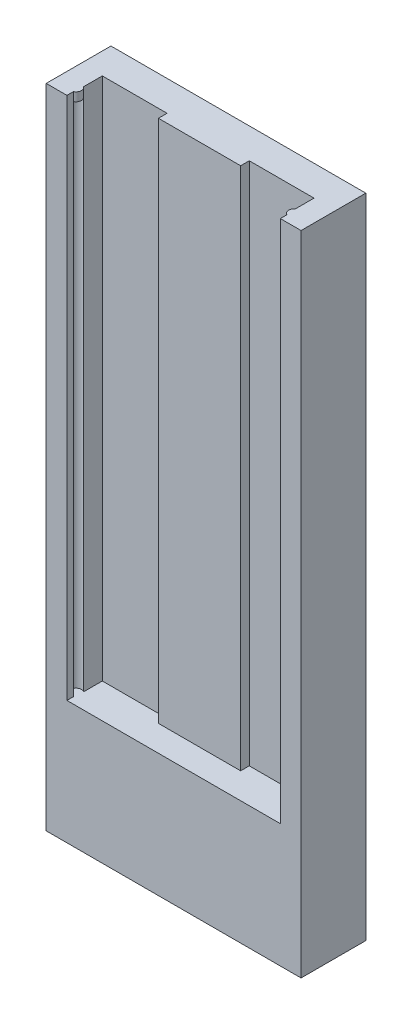
ISO-10303-21;
HEADER;
FILE_DESCRIPTION(('STEP AP214'),'2;1');
FILE_NAME('part.step','',(''),(''),'','','');
FILE_SCHEMA(('AUTOMOTIVE_DESIGN { 1 0 10303 214 1 1 1 1 }'));
ENDSEC;
DATA;
#1=APPLICATION_CONTEXT('core data for automotive mechanical design processes');
#2=APPLICATION_PROTOCOL_DEFINITION('international standard','automotive_design',2000,#1);
#3=PRODUCT_CONTEXT('',#1,'mechanical');
#4=PRODUCT('Part','Part','',(#3));
#5=PRODUCT_RELATED_PRODUCT_CATEGORY('part','',(#4));
#6=PRODUCT_DEFINITION_FORMATION('','',#4);
#7=PRODUCT_DEFINITION_CONTEXT('part definition',#1,'design');
#8=PRODUCT_DEFINITION('design','',#6,#7);
#9=PRODUCT_DEFINITION_SHAPE('','',#8);
#10=(LENGTH_UNIT() NAMED_UNIT(*) SI_UNIT(.MILLI.,.METRE.));
#11=(NAMED_UNIT(*) PLANE_ANGLE_UNIT() SI_UNIT($,.RADIAN.));
#12=(NAMED_UNIT(*) SI_UNIT($,.STERADIAN.) SOLID_ANGLE_UNIT());
#13=UNCERTAINTY_MEASURE_WITH_UNIT(LENGTH_MEASURE(1.E-05),#10,'distance_accuracy_value','');
#14=(GEOMETRIC_REPRESENTATION_CONTEXT(3) GLOBAL_UNCERTAINTY_ASSIGNED_CONTEXT((#13)) GLOBAL_UNIT_ASSIGNED_CONTEXT((#10,
#11,#12)) REPRESENTATION_CONTEXT('',''));
#15=CARTESIAN_POINT('',(0.,0.,0.));
#16=DIRECTION('',(0.,0.,1.));
#17=DIRECTION('',(1.,0.,0.));
#18=AXIS2_PLACEMENT_3D('',#15,#16,#17);
#19=CARTESIAN_POINT('',(30.089008082544,323.85,-12.4311195470876));
#20=DIRECTION('',(0.,-1.,0.));
#21=DIRECTION('',(0.,0.,-1.));
#22=AXIS2_PLACEMENT_3D('',#19,#20,#21);
#23=CYLINDRICAL_SURFACE('',#22,2.2225);
#24=CARTESIAN_POINT('',(30.089008082544,107.95,-12.4311195470876));
#25=DIRECTION('',(0.,-1.,0.));
#26=DIRECTION('',(0.,0.,-1.));
#27=AXIS2_PLACEMENT_3D('',#24,#25,#26);
#28=CIRCLE('',#27,2.2225);
#29=CARTESIAN_POINT('',(31.39,107.95,-14.2330424868145));
#30=VERTEX_POINT('',#29);
#31=CARTESIAN_POINT('',(31.0344,107.95,-10.4197169587406));
#32=VERTEX_POINT('',#31);
#33=EDGE_CURVE('E264',#30,#32,#28,.F.);
#34=ORIENTED_EDGE('',*,*,#33,.F.);
#35=DIRECTION('',(0.,-1.,0.));
#36=VECTOR('',#35,1.);
#37=CARTESIAN_POINT('',(31.39,323.85,-14.2330424868145));
#38=LINE('',#37,#36);
#39=CARTESIAN_POINT('',(31.39,320.294,-14.2330424868145));
#40=VERTEX_POINT('',#39);
#41=EDGE_CURVE('E174',#40,#30,#38,.T.);
#42=ORIENTED_EDGE('',*,*,#41,.F.);
#43=CARTESIAN_POINT('',(30.089008082544,320.294,-12.4311195470876));
#44=DIRECTION('',(0.,1.,0.));
#45=DIRECTION('',(0.,0.,1.));
#46=AXIS2_PLACEMENT_3D('',#43,#44,#45);
#47=CIRCLE('',#46,2.2225);
#48=CARTESIAN_POINT('',(31.0344,320.294,-10.4197169587406));
#49=VERTEX_POINT('',#48);
#50=EDGE_CURVE('E168',#40,#49,#47,.T.);
#51=ORIENTED_EDGE('',*,*,#50,.T.);
#52=DIRECTION('',(0.,-1.,0.));
#53=VECTOR('',#52,1.);
#54=CARTESIAN_POINT('',(31.0344,323.85,-10.4197169587406));
#55=LINE('',#54,#53);
#56=EDGE_CURVE('E164',#49,#32,#55,.T.);
#57=ORIENTED_EDGE('',*,*,#56,.T.);
#58=EDGE_LOOP('',(#34,#42,#51,#57));
#59=FACE_BOUND('',#58,.T.);
#60=ADVANCED_FACE('F35',(#59),#23,.F.);
#61=CARTESIAN_POINT('',(119.910991917456,323.85,-12.4311195470876));
#62=DIRECTION('',(0.,-1.,0.));
#63=DIRECTION('',(0.,0.,-1.));
#64=AXIS2_PLACEMENT_3D('',#61,#62,#63);
#65=CYLINDRICAL_SURFACE('',#64,2.2225);
#66=CARTESIAN_POINT('',(119.910991917456,107.95,-12.4311195470876));
#67=DIRECTION('',(0.,-1.,0.));
#68=DIRECTION('',(0.,0.,-1.));
#69=AXIS2_PLACEMENT_3D('',#66,#67,#68);
#70=CIRCLE('',#69,2.2225);
#71=CARTESIAN_POINT('',(118.9656,107.95,-10.4197169587406));
#72=VERTEX_POINT('',#71);
#73=CARTESIAN_POINT('',(118.61,107.95,-14.2330424868145));
#74=VERTEX_POINT('',#73);
#75=EDGE_CURVE('E287',#72,#74,#70,.F.);
#76=ORIENTED_EDGE('',*,*,#75,.F.);
#77=DIRECTION('',(0.,-1.,0.));
#78=VECTOR('',#77,1.);
#79=CARTESIAN_POINT('',(118.9656,323.85,-10.4197169587406));
#80=LINE('',#79,#78);
#81=CARTESIAN_POINT('',(118.9656,320.294,-10.4197169587406));
#82=VERTEX_POINT('',#81);
#83=EDGE_CURVE('E203',#82,#72,#80,.T.);
#84=ORIENTED_EDGE('',*,*,#83,.F.);
#85=CARTESIAN_POINT('',(119.910991917456,320.294,-12.4311195470876));
#86=DIRECTION('',(0.,1.,0.));
#87=DIRECTION('',(0.,0.,1.));
#88=AXIS2_PLACEMENT_3D('',#85,#86,#87);
#89=CIRCLE('',#88,2.2225);
#90=CARTESIAN_POINT('',(118.61,320.294,-14.2330424868145));
#91=VERTEX_POINT('',#90);
#92=EDGE_CURVE('E259',#82,#91,#89,.T.);
#93=ORIENTED_EDGE('',*,*,#92,.T.);
#94=DIRECTION('',(0.,-1.,0.));
#95=VECTOR('',#94,1.);
#96=CARTESIAN_POINT('',(118.61,323.85,-14.2330424868145));
#97=LINE('',#96,#95);
#98=EDGE_CURVE('E199',#91,#74,#97,.T.);
#99=ORIENTED_EDGE('',*,*,#98,.T.);
#100=EDGE_LOOP('',(#76,#84,#93,#99));
#101=FACE_BOUND('',#100,.T.);
#102=ADVANCED_FACE('F338',(#101),#65,.F.);
#103=CARTESIAN_POINT('',(31.0344,323.85,-10.4197169587406));
#104=DIRECTION('',(-1.,0.,0.));
#105=DIRECTION('',(0.,0.,1.));
#106=AXIS2_PLACEMENT_3D('',#103,#104,#105);
#107=PLANE('',#106);
#108=DIRECTION('',(0.,0.,1.));
#109=VECTOR('',#108,1.);
#110=CARTESIAN_POINT('',(31.0344,107.95,-10.4197169587406));
#111=LINE('',#110,#109);
#112=CARTESIAN_POINT('',(31.0344,107.95,-7.7527169587406));
#113=VERTEX_POINT('',#112);
#114=EDGE_CURVE('E52',#32,#113,#111,.T.);
#115=ORIENTED_EDGE('',*,*,#114,.F.);
#116=ORIENTED_EDGE('',*,*,#56,.F.);
#117=CARTESIAN_POINT('',(31.0344,323.85,-10.4197169587406));
#118=VERTEX_POINT('',#117);
#119=EDGE_CURVE('E43',#118,#49,#55,.T.);
#120=ORIENTED_EDGE('',*,*,#119,.F.);
#121=DIRECTION('',(0.,0.,-1.));
#122=VECTOR('',#121,1.);
#123=CARTESIAN_POINT('',(31.0344,323.85,-10.4197169587406));
#124=LINE('',#123,#122);
#125=CARTESIAN_POINT('',(31.0344,323.85,-7.7527169587406));
#126=VERTEX_POINT('',#125);
#127=EDGE_CURVE('E254',#126,#118,#124,.T.);
#128=ORIENTED_EDGE('',*,*,#127,.F.);
#129=DIRECTION('',(0.,-1.,0.));
#130=VECTOR('',#129,1.);
#131=CARTESIAN_POINT('',(31.0344,323.85,-7.7527169587406));
#132=LINE('',#131,#130);
#133=EDGE_CURVE('E11',#126,#113,#132,.T.);
#134=ORIENTED_EDGE('',*,*,#133,.T.);
#135=EDGE_LOOP('',(#115,#116,#120,#128,#134));
#136=FACE_BOUND('',#135,.T.);
#137=ADVANCED_FACE('F37',(#136),#107,.F.);
#138=CARTESIAN_POINT('',(31.39,323.85,-14.2330424868145));
#139=DIRECTION('',(-1.,0.,0.));
#140=DIRECTION('',(0.,0.,1.));
#141=AXIS2_PLACEMENT_3D('',#138,#139,#140);
#142=PLANE('',#141);
#143=DIRECTION('',(0.,0.,1.));
#144=VECTOR('',#143,1.);
#145=CARTESIAN_POINT('',(31.39,107.95,-14.2330424868145));
#146=LINE('',#145,#144);
#147=CARTESIAN_POINT('',(31.39,107.95,-21.9767169587406));
#148=VERTEX_POINT('',#147);
#149=EDGE_CURVE('E266',#148,#30,#146,.T.);
#150=ORIENTED_EDGE('',*,*,#149,.F.);
#151=DIRECTION('',(0.,-1.,0.));
#152=VECTOR('',#151,1.);
#153=CARTESIAN_POINT('',(31.39,323.85,-21.9767169587406));
#154=LINE('',#153,#152);
#155=CARTESIAN_POINT('',(31.39,323.85,-21.9767169587406));
#156=VERTEX_POINT('',#155);
#157=EDGE_CURVE('E179',#156,#148,#154,.T.);
#158=ORIENTED_EDGE('',*,*,#157,.F.);
#159=DIRECTION('',(0.,0.,-1.));
#160=VECTOR('',#159,1.);
#161=CARTESIAN_POINT('',(31.39,323.85,-14.2330424868145));
#162=LINE('',#161,#160);
#163=CARTESIAN_POINT('',(31.39,323.85,-14.2330424868145));
#164=VERTEX_POINT('',#163);
#165=EDGE_CURVE('E252',#164,#156,#162,.T.);
#166=ORIENTED_EDGE('',*,*,#165,.F.);
#167=EDGE_CURVE('E176',#164,#40,#38,.T.);
#168=ORIENTED_EDGE('',*,*,#167,.T.);
#169=ORIENTED_EDGE('',*,*,#41,.T.);
#170=EDGE_LOOP('',(#150,#158,#166,#168,#169));
#171=FACE_BOUND('',#170,.T.);
#172=ADVANCED_FACE('F304',(#171),#142,.F.);
#173=CARTESIAN_POINT('',(58.06,323.85,-21.9767169587406));
#174=DIRECTION('',(0.,0.,-1.));
#175=DIRECTION('',(-1.,0.,0.));
#176=AXIS2_PLACEMENT_3D('',#173,#174,#175);
#177=PLANE('',#176);
#178=DIRECTION('',(-1.,0.,0.));
#179=VECTOR('',#178,1.);
#180=CARTESIAN_POINT('',(58.06,107.95,-21.9767169587406));
#181=LINE('',#180,#179);
#182=CARTESIAN_POINT('',(58.06,107.95,-21.9767169587406));
#183=VERTEX_POINT('',#182);
#184=EDGE_CURVE('E269',#183,#148,#181,.T.);
#185=ORIENTED_EDGE('',*,*,#184,.F.);
#186=DIRECTION('',(0.,-1.,0.));
#187=VECTOR('',#186,1.);
#188=CARTESIAN_POINT('',(58.06,323.85,-21.9767169587406));
#189=LINE('',#188,#187);
#190=CARTESIAN_POINT('',(58.06,323.85,-21.9767169587406));
#191=VERTEX_POINT('',#190);
#192=EDGE_CURVE('E182',#191,#183,#189,.T.);
#193=ORIENTED_EDGE('',*,*,#192,.F.);
#194=DIRECTION('',(1.,0.,0.));
#195=VECTOR('',#194,1.);
#196=CARTESIAN_POINT('',(58.06,323.85,-21.9767169587406));
#197=LINE('',#196,#195);
#198=EDGE_CURVE('E250',#156,#191,#197,.T.);
#199=ORIENTED_EDGE('',*,*,#198,.F.);
#200=ORIENTED_EDGE('',*,*,#157,.T.);
#201=EDGE_LOOP('',(#185,#193,#199,#200));
#202=FACE_BOUND('',#201,.T.);
#203=ADVANCED_FACE('F362',(#202),#177,.F.);
#204=CARTESIAN_POINT('',(58.06,323.85,-18.4207169587406));
#205=DIRECTION('',(1.,0.,0.));
#206=DIRECTION('',(0.,0.,-1.));
#207=AXIS2_PLACEMENT_3D('',#204,#205,#206);
#208=PLANE('',#207);
#209=DIRECTION('',(0.,0.,-1.));
#210=VECTOR('',#209,1.);
#211=CARTESIAN_POINT('',(58.06,107.95,-18.4207169587406));
#212=LINE('',#211,#210);
#213=CARTESIAN_POINT('',(58.06,107.95,-18.4207169587406));
#214=VERTEX_POINT('',#213);
#215=EDGE_CURVE('E272',#214,#183,#212,.T.);
#216=ORIENTED_EDGE('',*,*,#215,.F.);
#217=DIRECTION('',(0.,-1.,0.));
#218=VECTOR('',#217,1.);
#219=CARTESIAN_POINT('',(58.06,323.85,-18.4207169587406));
#220=LINE('',#219,#218);
#221=CARTESIAN_POINT('',(58.06,323.85,-18.4207169587406));
#222=VERTEX_POINT('',#221);
#223=EDGE_CURVE('E185',#222,#214,#220,.T.);
#224=ORIENTED_EDGE('',*,*,#223,.F.);
#225=DIRECTION('',(0.,0.,1.));
#226=VECTOR('',#225,1.);
#227=CARTESIAN_POINT('',(58.06,323.85,-18.4207169587406));
#228=LINE('',#227,#226);
#229=EDGE_CURVE('E248',#191,#222,#228,.T.);
#230=ORIENTED_EDGE('',*,*,#229,.F.);
#231=ORIENTED_EDGE('',*,*,#192,.T.);
#232=EDGE_LOOP('',(#216,#224,#230,#231));
#233=FACE_BOUND('',#232,.T.);
#234=ADVANCED_FACE('F360',(#233),#208,.F.);
#235=CARTESIAN_POINT('',(91.94,323.85,-18.4207169587406));
#236=DIRECTION('',(0.,0.,-1.));
#237=DIRECTION('',(-1.,0.,0.));
#238=AXIS2_PLACEMENT_3D('',#235,#236,#237);
#239=PLANE('',#238);
#240=DIRECTION('',(-1.,0.,0.));
#241=VECTOR('',#240,1.);
#242=CARTESIAN_POINT('',(91.94,107.95,-18.4207169587406));
#243=LINE('',#242,#241);
#244=CARTESIAN_POINT('',(91.94,107.95,-18.4207169587406));
#245=VERTEX_POINT('',#244);
#246=EDGE_CURVE('E275',#245,#214,#243,.T.);
#247=ORIENTED_EDGE('',*,*,#246,.F.);
#248=DIRECTION('',(0.,-1.,0.));
#249=VECTOR('',#248,1.);
#250=CARTESIAN_POINT('',(91.94,323.85,-18.4207169587406));
#251=LINE('',#250,#249);
#252=CARTESIAN_POINT('',(91.94,323.85,-18.4207169587406));
#253=VERTEX_POINT('',#252);
#254=EDGE_CURVE('E188',#253,#245,#251,.T.);
#255=ORIENTED_EDGE('',*,*,#254,.F.);
#256=DIRECTION('',(1.,0.,0.));
#257=VECTOR('',#256,1.);
#258=CARTESIAN_POINT('',(91.94,323.85,-18.4207169587406));
#259=LINE('',#258,#257);
#260=EDGE_CURVE('E246',#222,#253,#259,.T.);
#261=ORIENTED_EDGE('',*,*,#260,.F.);
#262=ORIENTED_EDGE('',*,*,#223,.T.);
#263=EDGE_LOOP('',(#247,#255,#261,#262));
#264=FACE_BOUND('',#263,.T.);
#265=ADVANCED_FACE('F355',(#264),#239,.F.);
#266=CARTESIAN_POINT('',(91.94,323.85,-21.9767169587406));
#267=DIRECTION('',(-1.,0.,0.));
#268=DIRECTION('',(0.,0.,1.));
#269=AXIS2_PLACEMENT_3D('',#266,#267,#268);
#270=PLANE('',#269);
#271=DIRECTION('',(0.,0.,1.));
#272=VECTOR('',#271,1.);
#273=CARTESIAN_POINT('',(91.94,107.95,-21.9767169587406));
#274=LINE('',#273,#272);
#275=CARTESIAN_POINT('',(91.94,107.95,-21.9767169587406));
#276=VERTEX_POINT('',#275);
#277=EDGE_CURVE('E278',#276,#245,#274,.T.);
#278=ORIENTED_EDGE('',*,*,#277,.F.);
#279=DIRECTION('',(0.,-1.,0.));
#280=VECTOR('',#279,1.);
#281=CARTESIAN_POINT('',(91.94,323.85,-21.9767169587406));
#282=LINE('',#281,#280);
#283=CARTESIAN_POINT('',(91.94,323.85,-21.9767169587406));
#284=VERTEX_POINT('',#283);
#285=EDGE_CURVE('E191',#284,#276,#282,.T.);
#286=ORIENTED_EDGE('',*,*,#285,.F.);
#287=DIRECTION('',(0.,0.,-1.));
#288=VECTOR('',#287,1.);
#289=CARTESIAN_POINT('',(91.94,323.85,-21.9767169587406));
#290=LINE('',#289,#288);
#291=EDGE_CURVE('E244',#253,#284,#290,.T.);
#292=ORIENTED_EDGE('',*,*,#291,.F.);
#293=ORIENTED_EDGE('',*,*,#254,.T.);
#294=EDGE_LOOP('',(#278,#286,#292,#293));
#295=FACE_BOUND('',#294,.T.);
#296=ADVANCED_FACE('F352',(#295),#270,.F.);
#297=CARTESIAN_POINT('',(118.61,323.85,-21.9767169587406));
#298=DIRECTION('',(0.,0.,-1.));
#299=DIRECTION('',(-1.,0.,0.));
#300=AXIS2_PLACEMENT_3D('',#297,#298,#299);
#301=PLANE('',#300);
#302=DIRECTION('',(-1.,0.,0.));
#303=VECTOR('',#302,1.);
#304=CARTESIAN_POINT('',(118.61,107.95,-21.9767169587406));
#305=LINE('',#304,#303);
#306=CARTESIAN_POINT('',(118.61,107.95,-21.9767169587406));
#307=VERTEX_POINT('',#306);
#308=EDGE_CURVE('E281',#307,#276,#305,.T.);
#309=ORIENTED_EDGE('',*,*,#308,.F.);
#310=DIRECTION('',(0.,-1.,0.));
#311=VECTOR('',#310,1.);
#312=CARTESIAN_POINT('',(118.61,323.85,-21.9767169587406));
#313=LINE('',#312,#311);
#314=CARTESIAN_POINT('',(118.61,323.85,-21.9767169587406));
#315=VERTEX_POINT('',#314);
#316=EDGE_CURVE('E194',#315,#307,#313,.T.);
#317=ORIENTED_EDGE('',*,*,#316,.F.);
#318=DIRECTION('',(1.,0.,0.));
#319=VECTOR('',#318,1.);
#320=CARTESIAN_POINT('',(118.61,323.85,-21.9767169587406));
#321=LINE('',#320,#319);
#322=EDGE_CURVE('E242',#284,#315,#321,.T.);
#323=ORIENTED_EDGE('',*,*,#322,.F.);
#324=ORIENTED_EDGE('',*,*,#285,.T.);
#325=EDGE_LOOP('',(#309,#317,#323,#324));
#326=FACE_BOUND('',#325,.T.);
#327=ADVANCED_FACE('F348',(#326),#301,.F.);
#328=CARTESIAN_POINT('',(118.61,323.85,-14.2330424868145));
#329=DIRECTION('',(1.,0.,0.));
#330=DIRECTION('',(0.,0.,-1.));
#331=AXIS2_PLACEMENT_3D('',#328,#329,#330);
#332=PLANE('',#331);
#333=DIRECTION('',(0.,0.,-1.));
#334=VECTOR('',#333,1.);
#335=CARTESIAN_POINT('',(118.61,107.95,-14.2330424868145));
#336=LINE('',#335,#334);
#337=EDGE_CURVE('E284',#74,#307,#336,.T.);
#338=ORIENTED_EDGE('',*,*,#337,.F.);
#339=ORIENTED_EDGE('',*,*,#98,.F.);
#340=CARTESIAN_POINT('',(118.61,323.85,-14.2330424868145));
#341=VERTEX_POINT('',#340);
#342=EDGE_CURVE('E197',#341,#91,#97,.T.);
#343=ORIENTED_EDGE('',*,*,#342,.F.);
#344=DIRECTION('',(0.,0.,1.));
#345=VECTOR('',#344,1.);
#346=CARTESIAN_POINT('',(118.61,323.85,-14.2330424868145));
#347=LINE('',#346,#345);
#348=EDGE_CURVE('E239',#315,#341,#347,.T.);
#349=ORIENTED_EDGE('',*,*,#348,.F.);
#350=ORIENTED_EDGE('',*,*,#316,.T.);
#351=EDGE_LOOP('',(#338,#339,#343,#349,#350));
#352=FACE_BOUND('',#351,.T.);
#353=ADVANCED_FACE('F342',(#352),#332,.F.);
#354=CARTESIAN_POINT('',(118.9656,323.85,-7.7527169587406));
#355=DIRECTION('',(1.,0.,0.));
#356=DIRECTION('',(0.,0.,-1.));
#357=AXIS2_PLACEMENT_3D('',#354,#355,#356);
#358=PLANE('',#357);
#359=DIRECTION('',(0.,0.,-1.));
#360=VECTOR('',#359,1.);
#361=CARTESIAN_POINT('',(118.9656,107.95,-7.7527169587406));
#362=LINE('',#361,#360);
#363=CARTESIAN_POINT('',(118.9656,107.95,-7.7527169587406));
#364=VERTEX_POINT('',#363);
#365=EDGE_CURVE('E290',#364,#72,#362,.T.);
#366=ORIENTED_EDGE('',*,*,#365,.F.);
#367=DIRECTION('',(0.,-1.,0.));
#368=VECTOR('',#367,1.);
#369=CARTESIAN_POINT('',(118.9656,323.85,-7.7527169587406));
#370=LINE('',#369,#368);
#371=CARTESIAN_POINT('',(118.9656,323.85,-7.7527169587406));
#372=VERTEX_POINT('',#371);
#373=EDGE_CURVE('E204',#372,#364,#370,.T.);
#374=ORIENTED_EDGE('',*,*,#373,.F.);
#375=DIRECTION('',(0.,0.,1.));
#376=VECTOR('',#375,1.);
#377=CARTESIAN_POINT('',(118.9656,323.85,-7.7527169587406));
#378=LINE('',#377,#376);
#379=CARTESIAN_POINT('',(118.9656,323.85,-10.4197169587406));
#380=VERTEX_POINT('',#379);
#381=EDGE_CURVE('E237',#380,#372,#378,.T.);
#382=ORIENTED_EDGE('',*,*,#381,.F.);
#383=EDGE_CURVE('E200',#380,#82,#80,.T.);
#384=ORIENTED_EDGE('',*,*,#383,.T.);
#385=ORIENTED_EDGE('',*,*,#83,.T.);
#386=EDGE_LOOP('',(#366,#374,#382,#384,#385));
#387=FACE_BOUND('',#386,.T.);
#388=ADVANCED_FACE('F333',(#387),#358,.F.);
#389=CARTESIAN_POINT('',(127.5,323.85,-7.7527169587406));
#390=DIRECTION('',(0.,0.,-1.));
#391=DIRECTION('',(-1.,0.,0.));
#392=AXIS2_PLACEMENT_3D('',#389,#390,#391);
#393=PLANE('',#392);
#394=DIRECTION('',(1.,0.,0.));
#395=VECTOR('',#394,1.);
#396=CARTESIAN_POINT('',(127.5,57.15,-7.7527169587406));
#397=LINE('',#396,#395);
#398=CARTESIAN_POINT('',(22.5,57.15,-7.7527169587406));
#399=VERTEX_POINT('',#398);
#400=CARTESIAN_POINT('',(127.5,57.15,-7.7527169587406));
#401=VERTEX_POINT('',#400);
#402=EDGE_CURVE('E226',#399,#401,#397,.T.);
#403=ORIENTED_EDGE('',*,*,#402,.T.);
#404=DIRECTION('',(0.,-1.,0.));
#405=VECTOR('',#404,1.);
#406=CARTESIAN_POINT('',(127.5,323.85,-7.7527169587406));
#407=LINE('',#406,#405);
#408=CARTESIAN_POINT('',(127.5,323.85,-7.7527169587406));
#409=VERTEX_POINT('',#408);
#410=EDGE_CURVE('E207',#409,#401,#407,.T.);
#411=ORIENTED_EDGE('',*,*,#410,.F.);
#412=DIRECTION('',(1.,0.,0.));
#413=VECTOR('',#412,1.);
#414=CARTESIAN_POINT('',(127.5,323.85,-7.7527169587406));
#415=LINE('',#414,#413);
#416=EDGE_CURVE('E235',#372,#409,#415,.T.);
#417=ORIENTED_EDGE('',*,*,#416,.F.);
#418=ORIENTED_EDGE('',*,*,#373,.T.);
#419=DIRECTION('',(-1.,0.,0.));
#420=VECTOR('',#419,1.);
#421=CARTESIAN_POINT('',(127.5,107.95,-7.7527169587406));
#422=LINE('',#421,#420);
#423=EDGE_CURVE('E293',#364,#113,#422,.T.);
#424=ORIENTED_EDGE('',*,*,#423,.T.);
#425=ORIENTED_EDGE('',*,*,#133,.F.);
#426=DIRECTION('',(1.,0.,0.));
#427=VECTOR('',#426,1.);
#428=CARTESIAN_POINT('',(31.0344,323.85,-7.7527169587406));
#429=LINE('',#428,#427);
#430=CARTESIAN_POINT('',(22.5,323.85,-7.7527169587406));
#431=VERTEX_POINT('',#430);
#432=EDGE_CURVE('E219',#431,#126,#429,.T.);
#433=ORIENTED_EDGE('',*,*,#432,.F.);
#434=DIRECTION('',(0.,-1.,0.));
#435=VECTOR('',#434,1.);
#436=CARTESIAN_POINT('',(22.5,323.85,-7.7527169587406));
#437=LINE('',#436,#435);
#438=EDGE_CURVE('E213',#431,#399,#437,.T.);
#439=ORIENTED_EDGE('',*,*,#438,.T.);
#440=EDGE_LOOP('',(#403,#411,#417,#418,#424,#425,#433,#439));
#441=FACE_BOUND('',#440,.T.);
#442=ADVANCED_FACE('F297',(#441),#393,.F.);
#443=CARTESIAN_POINT('',(127.5,323.85,-34.4227169587406));
#444=DIRECTION('',(-1.,0.,0.));
#445=DIRECTION('',(0.,0.,1.));
#446=AXIS2_PLACEMENT_3D('',#443,#444,#445);
#447=PLANE('',#446);
#448=DIRECTION('',(0.,0.,-1.));
#449=VECTOR('',#448,1.);
#450=CARTESIAN_POINT('',(127.5,57.15,-34.4227169587406));
#451=LINE('',#450,#449);
#452=CARTESIAN_POINT('',(127.5,57.15,-34.4227169587406));
#453=VERTEX_POINT('',#452);
#454=EDGE_CURVE('E223',#401,#453,#451,.T.);
#455=ORIENTED_EDGE('',*,*,#454,.T.);
#456=DIRECTION('',(0.,-1.,0.));
#457=VECTOR('',#456,1.);
#458=CARTESIAN_POINT('',(127.5,323.85,-34.4227169587406));
#459=LINE('',#458,#457);
#460=CARTESIAN_POINT('',(127.5,323.85,-34.4227169587406));
#461=VERTEX_POINT('',#460);
#462=EDGE_CURVE('E209',#461,#453,#459,.T.);
#463=ORIENTED_EDGE('',*,*,#462,.F.);
#464=DIRECTION('',(0.,0.,-1.));
#465=VECTOR('',#464,1.);
#466=CARTESIAN_POINT('',(127.5,323.85,-34.4227169587406));
#467=LINE('',#466,#465);
#468=EDGE_CURVE('E233',#409,#461,#467,.T.);
#469=ORIENTED_EDGE('',*,*,#468,.F.);
#470=ORIENTED_EDGE('',*,*,#410,.T.);
#471=EDGE_LOOP('',(#455,#463,#469,#470));
#472=FACE_BOUND('',#471,.T.);
#473=ADVANCED_FACE('F329',(#472),#447,.F.);
#474=CARTESIAN_POINT('',(22.5,323.85,-34.4227169587406));
#475=DIRECTION('',(0.,0.,1.));
#476=DIRECTION('',(1.,0.,0.));
#477=AXIS2_PLACEMENT_3D('',#474,#475,#476);
#478=PLANE('',#477);
#479=DIRECTION('',(-1.,0.,0.));
#480=VECTOR('',#479,1.);
#481=CARTESIAN_POINT('',(22.5,57.15,-34.4227169587406));
#482=LINE('',#481,#480);
#483=CARTESIAN_POINT('',(22.5,57.15,-34.4227169587406));
#484=VERTEX_POINT('',#483);
#485=EDGE_CURVE('E220',#453,#484,#482,.T.);
#486=ORIENTED_EDGE('',*,*,#485,.T.);
#487=DIRECTION('',(0.,-1.,0.));
#488=VECTOR('',#487,1.);
#489=CARTESIAN_POINT('',(22.5,323.85,-34.4227169587406));
#490=LINE('',#489,#488);
#491=CARTESIAN_POINT('',(22.5,323.85,-34.4227169587406));
#492=VERTEX_POINT('',#491);
#493=EDGE_CURVE('E211',#492,#484,#490,.T.);
#494=ORIENTED_EDGE('',*,*,#493,.F.);
#495=DIRECTION('',(-1.,0.,0.));
#496=VECTOR('',#495,1.);
#497=CARTESIAN_POINT('',(22.5,323.85,-34.4227169587406));
#498=LINE('',#497,#496);
#499=EDGE_CURVE('E231',#461,#492,#498,.T.);
#500=ORIENTED_EDGE('',*,*,#499,.F.);
#501=ORIENTED_EDGE('',*,*,#462,.T.);
#502=EDGE_LOOP('',(#486,#494,#500,#501));
#503=FACE_BOUND('',#502,.T.);
#504=ADVANCED_FACE('F325',(#503),#478,.F.);
#505=CARTESIAN_POINT('',(22.5,323.85,-7.7527169587406));
#506=DIRECTION('',(1.,0.,0.));
#507=DIRECTION('',(0.,0.,-1.));
#508=AXIS2_PLACEMENT_3D('',#505,#506,#507);
#509=PLANE('',#508);
#510=DIRECTION('',(0.,0.,1.));
#511=VECTOR('',#510,1.);
#512=CARTESIAN_POINT('',(22.5,57.15,-7.7527169587406));
#513=LINE('',#512,#511);
#514=EDGE_CURVE('E216',#484,#399,#513,.T.);
#515=ORIENTED_EDGE('',*,*,#514,.T.);
#516=ORIENTED_EDGE('',*,*,#438,.F.);
#517=DIRECTION('',(0.,0.,1.));
#518=VECTOR('',#517,1.);
#519=CARTESIAN_POINT('',(22.5,323.85,-7.7527169587406));
#520=LINE('',#519,#518);
#521=EDGE_CURVE('E215',#492,#431,#520,.T.);
#522=ORIENTED_EDGE('',*,*,#521,.F.);
#523=ORIENTED_EDGE('',*,*,#493,.T.);
#524=EDGE_LOOP('',(#515,#516,#522,#523));
#525=FACE_BOUND('',#524,.T.);
#526=ADVANCED_FACE('F321',(#525),#509,.F.);
#527=CARTESIAN_POINT('',(119.910991917456,323.85,-12.4311195470876));
#528=DIRECTION('',(0.,1.,0.));
#529=DIRECTION('',(0.,0.,1.));
#530=AXIS2_PLACEMENT_3D('',#527,#528,#529);
#531=PLANE('',#530);
#532=ORIENTED_EDGE('',*,*,#432,.T.);
#533=ORIENTED_EDGE('',*,*,#127,.T.);
#534=CARTESIAN_POINT('',(30.089008082544,323.85,-12.4311195470876));
#535=DIRECTION('',(0.,1.,0.));
#536=DIRECTION('',(0.,0.,1.));
#537=AXIS2_PLACEMENT_3D('',#534,#535,#536);
#538=CIRCLE('',#537,2.2225);
#539=EDGE_CURVE('E162',#118,#164,#538,.T.);
#540=ORIENTED_EDGE('',*,*,#539,.T.);
#541=ORIENTED_EDGE('',*,*,#165,.T.);
#542=ORIENTED_EDGE('',*,*,#198,.T.);
#543=ORIENTED_EDGE('',*,*,#229,.T.);
#544=ORIENTED_EDGE('',*,*,#260,.T.);
#545=ORIENTED_EDGE('',*,*,#291,.T.);
#546=ORIENTED_EDGE('',*,*,#322,.T.);
#547=ORIENTED_EDGE('',*,*,#348,.T.);
#548=CARTESIAN_POINT('',(119.910991917456,323.85,-12.4311195470876));
#549=DIRECTION('',(0.,1.,0.));
#550=DIRECTION('',(0.,0.,1.));
#551=AXIS2_PLACEMENT_3D('',#548,#549,#550);
#552=CIRCLE('',#551,2.2225);
#553=EDGE_CURVE('E169',#341,#380,#552,.T.);
#554=ORIENTED_EDGE('',*,*,#553,.T.);
#555=ORIENTED_EDGE('',*,*,#381,.T.);
#556=ORIENTED_EDGE('',*,*,#416,.T.);
#557=ORIENTED_EDGE('',*,*,#468,.T.);
#558=ORIENTED_EDGE('',*,*,#499,.T.);
#559=ORIENTED_EDGE('',*,*,#521,.T.);
#560=EDGE_LOOP('',(#532,#533,#540,#541,#542,#543,#544,#545,#546,#547,#554,#555,#556,#557,#558,#559));
#561=FACE_BOUND('',#560,.T.);
#562=ADVANCED_FACE('F309',(#561),#531,.T.);
#563=CARTESIAN_POINT('',(119.910991917456,57.15,-12.4311195470876));
#564=DIRECTION('',(0.,1.,0.));
#565=DIRECTION('',(0.,0.,1.));
#566=AXIS2_PLACEMENT_3D('',#563,#564,#565);
#567=PLANE('',#566);
#568=ORIENTED_EDGE('',*,*,#402,.F.);
#569=ORIENTED_EDGE('',*,*,#514,.F.);
#570=ORIENTED_EDGE('',*,*,#485,.F.);
#571=ORIENTED_EDGE('',*,*,#454,.F.);
#572=EDGE_LOOP('',(#568,#569,#570,#571));
#573=FACE_BOUND('',#572,.T.);
#574=ADVANCED_FACE('F319',(#573),#567,.F.);
#575=CARTESIAN_POINT('',(119.910991917456,320.294,-12.4311195470876));
#576=DIRECTION('',(0.,1.,0.));
#577=DIRECTION('',(0.,0.,1.));
#578=AXIS2_PLACEMENT_3D('',#575,#576,#577);
#579=CYLINDRICAL_SURFACE('',#578,2.2225);
#580=ORIENTED_EDGE('',*,*,#342,.T.);
#581=EDGE_CURVE('E229',#91,#82,#89,.T.);
#582=ORIENTED_EDGE('',*,*,#581,.T.);
#583=ORIENTED_EDGE('',*,*,#383,.F.);
#584=ORIENTED_EDGE('',*,*,#553,.F.);
#585=EDGE_LOOP('',(#580,#582,#583,#584));
#586=FACE_BOUND('',#585,.T.);
#587=ADVANCED_FACE('F446',(#586),#579,.T.);
#588=CARTESIAN_POINT('',(119.910991917456,320.294,-12.4311195470876));
#589=DIRECTION('',(0.,1.,0.));
#590=DIRECTION('',(0.,0.,1.));
#591=AXIS2_PLACEMENT_3D('',#588,#589,#590);
#592=PLANE('',#591);
#593=ORIENTED_EDGE('',*,*,#581,.F.);
#594=ORIENTED_EDGE('',*,*,#92,.F.);
#595=EDGE_LOOP('',(#593,#594));
#596=FACE_BOUND('',#595,.T.);
#597=ADVANCED_FACE('F453',(#596),#592,.F.);
#598=CARTESIAN_POINT('',(30.089008082544,320.294,-12.4311195470876));
#599=DIRECTION('',(0.,1.,0.));
#600=DIRECTION('',(0.,0.,1.));
#601=AXIS2_PLACEMENT_3D('',#598,#599,#600);
#602=CYLINDRICAL_SURFACE('',#601,2.2225);
#603=ORIENTED_EDGE('',*,*,#119,.T.);
#604=EDGE_CURVE('E160',#49,#40,#47,.T.);
#605=ORIENTED_EDGE('',*,*,#604,.T.);
#606=ORIENTED_EDGE('',*,*,#167,.F.);
#607=ORIENTED_EDGE('',*,*,#539,.F.);
#608=EDGE_LOOP('',(#603,#605,#606,#607));
#609=FACE_BOUND('',#608,.T.);
#610=ADVANCED_FACE('F158',(#609),#602,.T.);
#611=CARTESIAN_POINT('',(30.089008082544,320.294,-12.4311195470876));
#612=DIRECTION('',(0.,1.,0.));
#613=DIRECTION('',(0.,0.,1.));
#614=AXIS2_PLACEMENT_3D('',#611,#612,#613);
#615=PLANE('',#614);
#616=ORIENTED_EDGE('',*,*,#604,.F.);
#617=ORIENTED_EDGE('',*,*,#50,.F.);
#618=EDGE_LOOP('',(#616,#617));
#619=FACE_BOUND('',#618,.T.);
#620=ADVANCED_FACE('F167',(#619),#615,.F.);
#621=CARTESIAN_POINT('',(0.,107.95,0.));
#622=DIRECTION('',(0.,-1.,0.));
#623=DIRECTION('',(0.,0.,-1.));
#624=AXIS2_PLACEMENT_3D('',#621,#622,#623);
#625=PLANE('',#624);
#626=ORIENTED_EDGE('',*,*,#33,.T.);
#627=ORIENTED_EDGE('',*,*,#114,.T.);
#628=ORIENTED_EDGE('',*,*,#423,.F.);
#629=ORIENTED_EDGE('',*,*,#365,.T.);
#630=ORIENTED_EDGE('',*,*,#75,.T.);
#631=ORIENTED_EDGE('',*,*,#337,.T.);
#632=ORIENTED_EDGE('',*,*,#308,.T.);
#633=ORIENTED_EDGE('',*,*,#277,.T.);
#634=ORIENTED_EDGE('',*,*,#246,.T.);
#635=ORIENTED_EDGE('',*,*,#215,.T.);
#636=ORIENTED_EDGE('',*,*,#184,.T.);
#637=ORIENTED_EDGE('',*,*,#149,.T.);
#638=EDGE_LOOP('',(#626,#627,#628,#629,#630,#631,#632,#633,#634,#635,#636,#637));
#639=FACE_BOUND('',#638,.T.);
#640=ADVANCED_FACE('F302',(#639),#625,.F.);
#641=CLOSED_SHELL('',(#60,#102,#137,#172,#203,#234,#265,#296,#327,#353,#388,#442,#473,#504,#526,
#562,#574,#587,#597,#610,#620,#640));
#642=MANIFOLD_SOLID_BREP('B2',#641);
#643=ADVANCED_BREP_SHAPE_REPRESENTATION('',(#18,#642),#14);
#644=SHAPE_DEFINITION_REPRESENTATION(#9,#643);
ENDSEC;
END-ISO-10303-21;
